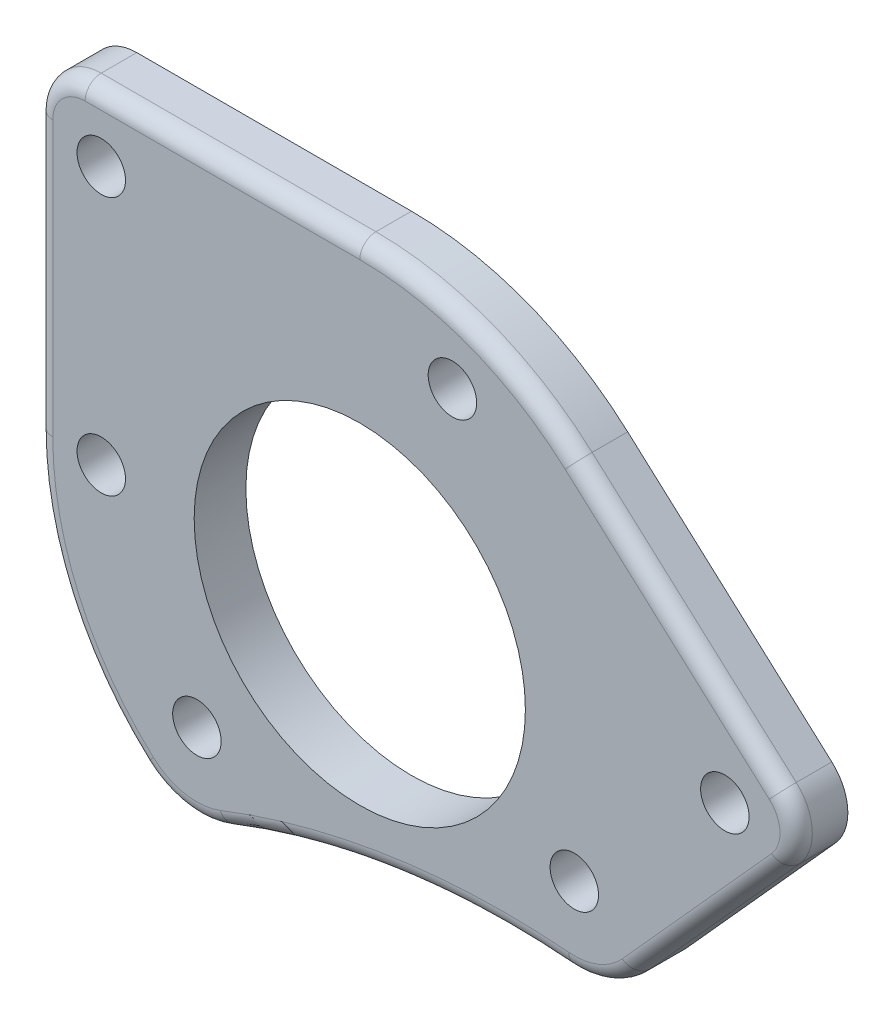
ISO-10303-21;
HEADER;
FILE_DESCRIPTION(('STEP AP214'),'2;1');
FILE_NAME('part.step','',(''),(''),'','','');
FILE_SCHEMA(('AUTOMOTIVE_DESIGN { 1 0 10303 214 1 1 1 1 }'));
ENDSEC;
DATA;
#1=APPLICATION_CONTEXT('core data for automotive mechanical design processes');
#2=APPLICATION_PROTOCOL_DEFINITION('international standard','automotive_design',2000,#1);
#3=PRODUCT_CONTEXT('',#1,'mechanical');
#4=PRODUCT('Part','Part','',(#3));
#5=PRODUCT_RELATED_PRODUCT_CATEGORY('part','',(#4));
#6=PRODUCT_DEFINITION_FORMATION('','',#4);
#7=PRODUCT_DEFINITION_CONTEXT('part definition',#1,'design');
#8=PRODUCT_DEFINITION('design','',#6,#7);
#9=PRODUCT_DEFINITION_SHAPE('','',#8);
#10=(LENGTH_UNIT() NAMED_UNIT(*) SI_UNIT(.MILLI.,.METRE.));
#11=(NAMED_UNIT(*) PLANE_ANGLE_UNIT() SI_UNIT($,.RADIAN.));
#12=(NAMED_UNIT(*) SI_UNIT($,.STERADIAN.) SOLID_ANGLE_UNIT());
#13=UNCERTAINTY_MEASURE_WITH_UNIT(LENGTH_MEASURE(1.E-05),#10,'distance_accuracy_value','');
#14=(GEOMETRIC_REPRESENTATION_CONTEXT(3) GLOBAL_UNCERTAINTY_ASSIGNED_CONTEXT((#13)) GLOBAL_UNIT_ASSIGNED_CONTEXT((#10,
#11,#12)) REPRESENTATION_CONTEXT('',''));
#15=CARTESIAN_POINT('',(0.,0.,0.));
#16=DIRECTION('',(0.,0.,1.));
#17=DIRECTION('',(1.,0.,0.));
#18=AXIS2_PLACEMENT_3D('',#15,#16,#17);
#19=CARTESIAN_POINT('',(-9.04859708366365,60.,3.2));
#20=DIRECTION('',(0.,0.,1.));
#21=DIRECTION('',(1.,0.,0.));
#22=AXIS2_PLACEMENT_3D('',#19,#20,#21);
#23=PLANE('',#22);
#24=DIRECTION('',(-0.743144825477398,0.669130606358854,0.));
#25=VECTOR('',#24,1.);
#26=CARTESIAN_POINT('',(3.66488443715523,74.119751684072,3.2));
#27=LINE('',#26,#25);
#28=CARTESIAN_POINT('',(16.2983464702709,62.7445313759716,3.2));
#29=VERTEX_POINT('',#28);
#30=CARTESIAN_POINT('',(3.66488443715524,74.119751684072,3.2));
#31=VERTEX_POINT('',#30);
#32=EDGE_CURVE('E244',#29,#31,#27,.T.);
#33=ORIENTED_EDGE('',*,*,#32,.T.);
#34=CARTESIAN_POINT('',(-9.04859708366365,60.,3.2));
#35=DIRECTION('',(0.,0.,1.));
#36=DIRECTION('',(1.,0.,0.));
#37=AXIS2_PLACEMENT_3D('',#34,#35,#36);
#38=CIRCLE('',#37,19.0000000000015);
#39=CARTESIAN_POINT('',(-9.0485970836632,79.0000000000015,3.2));
#40=VERTEX_POINT('',#39);
#41=EDGE_CURVE('E246',#31,#40,#38,.T.);
#42=ORIENTED_EDGE('',*,*,#41,.T.);
#43=DIRECTION('',(-1.,0.,0.));
#44=VECTOR('',#43,1.);
#45=CARTESIAN_POINT('',(-26.0485970836631,79.0000000000015,3.2));
#46=LINE('',#45,#44);
#47=CARTESIAN_POINT('',(-26.0485970836632,79.0000000000015,3.2));
#48=VERTEX_POINT('',#47);
#49=EDGE_CURVE('E161',#40,#48,#46,.T.);
#50=ORIENTED_EDGE('',*,*,#49,.T.);
#51=CARTESIAN_POINT('',(-26.0485970836632,77.0000000000015,3.2));
#52=DIRECTION('',(0.,0.,1.));
#53=DIRECTION('',(1.,0.,0.));
#54=AXIS2_PLACEMENT_3D('',#51,#52,#53);
#55=CIRCLE('',#54,2.);
#56=CARTESIAN_POINT('',(-28.0485970836632,77.0000000000015,3.2));
#57=VERTEX_POINT('',#56);
#58=EDGE_CURVE('E228',#48,#57,#55,.T.);
#59=ORIENTED_EDGE('',*,*,#58,.T.);
#60=DIRECTION('',(0.,-1.,0.));
#61=VECTOR('',#60,1.);
#62=CARTESIAN_POINT('',(-28.0485970836632,60.0000000000015,3.2));
#63=LINE('',#62,#61);
#64=CARTESIAN_POINT('',(-28.0485970836632,60.0000000000015,3.2));
#65=VERTEX_POINT('',#64);
#66=EDGE_CURVE('E230',#57,#65,#63,.T.);
#67=ORIENTED_EDGE('',*,*,#66,.T.);
#68=CARTESIAN_POINT('',(-9.04859708366318,60.0000000000015,3.2));
#69=DIRECTION('',(0.,0.,1.));
#70=DIRECTION('',(1.,0.,0.));
#71=AXIS2_PLACEMENT_3D('',#68,#69,#70);
#72=CIRCLE('',#71,19.);
#73=CARTESIAN_POINT('',(-21.8160508217506,45.9290325476266,3.2));
#74=VERTEX_POINT('',#73);
#75=EDGE_CURVE('E232',#65,#74,#72,.T.);
#76=ORIENTED_EDGE('',*,*,#75,.T.);
#77=CARTESIAN_POINT('',(-19.1281658242585,48.8913414849687,3.2));
#78=DIRECTION('',(0.,0.,1.));
#79=DIRECTION('',(1.,0.,0.));
#80=AXIS2_PLACEMENT_3D('',#77,#78,#79);
#81=CIRCLE('',#80,3.99999999999999);
#82=CARTESIAN_POINT('',(-17.6707817614579,45.1662868956379,3.2));
#83=VERTEX_POINT('',#82);
#84=EDGE_CURVE('E234',#74,#83,#81,.T.);
#85=ORIENTED_EDGE('',*,*,#84,.T.);
#86=CARTESIAN_POINT('',(1.11022302462516E-13,1.60982338570648E-12,3.2));
#87=DIRECTION('',(0.,0.,1.));
#88=DIRECTION('',(1.,0.,0.));
#89=AXIS2_PLACEMENT_3D('',#86,#87,#88);
#90=CIRCLE('',#89,48.5);
#91=CARTESIAN_POINT('',(3.90700568195662,48.3423758890822,3.2));
#92=VERTEX_POINT('',#91);
#93=EDGE_CURVE('E236',#83,#92,#90,.F.);
#94=ORIENTED_EDGE('',*,*,#93,.T.);
#95=CARTESIAN_POINT('',(4.22923295469529,52.3293759624084,3.2));
#96=DIRECTION('',(0.,0.,1.));
#97=DIRECTION('',(1.,0.,0.));
#98=AXIS2_PLACEMENT_3D('',#95,#96,#97);
#99=CIRCLE('',#98,4.00000000000005);
#100=CARTESIAN_POINT('',(7.20181225660493,49.652853536973,3.2));
#101=VERTEX_POINT('',#100);
#102=EDGE_CURVE('E238',#92,#101,#99,.T.);
#103=ORIENTED_EDGE('',*,*,#102,.T.);
#104=DIRECTION('',(0.669130606358855,0.743144825477397,0.));
#105=VECTOR('',#104,1.);
#106=CARTESIAN_POINT('',(16.446374908508,59.9199805122991,3.2));
#107=LINE('',#106,#105);
#108=CARTESIAN_POINT('',(16.446374908508,59.9199805122991,3.2));
#109=VERTEX_POINT('',#108);
#110=EDGE_CURVE('E240',#101,#109,#107,.T.);
#111=ORIENTED_EDGE('',*,*,#110,.T.);
#112=CARTESIAN_POINT('',(14.9600852575532,61.2582417250168,3.2));
#113=DIRECTION('',(0.,0.,1.));
#114=DIRECTION('',(1.,0.,0.));
#115=AXIS2_PLACEMENT_3D('',#112,#113,#114);
#116=CIRCLE('',#115,2.00000000000001);
#117=EDGE_CURVE('E242',#109,#29,#116,.T.);
#118=ORIENTED_EDGE('',*,*,#117,.T.);
#119=EDGE_LOOP('',(#33,#42,#50,#59,#67,#76,#85,#94,#103,#111,#118));
#120=FACE_BOUND('',#119,.T.);
#121=CARTESIAN_POINT('',(4.22923295469568,52.3293759624067,3.2));
#122=DIRECTION('',(0.,0.,1.));
#123=DIRECTION('',(1.,0.,0.));
#124=AXIS2_PLACEMENT_3D('',#121,#122,#123);
#125=CIRCLE('',#124,1.50000000000087);
#126=CARTESIAN_POINT('',(5.72923295469655,52.3293759624067,3.2));
#127=VERTEX_POINT('',#126);
#128=EDGE_CURVE('E312',#127,#127,#125,.T.);
#129=ORIENTED_EDGE('',*,*,#128,.F.);
#130=EDGE_LOOP('',(#129));
#131=FACE_BOUND('',#130,.T.);
#132=CARTESIAN_POINT('',(-25.0485970836627,60.0000000000001,3.2));
#133=DIRECTION('',(0.,0.,1.));
#134=DIRECTION('',(1.,0.,0.));
#135=AXIS2_PLACEMENT_3D('',#132,#133,#134);
#136=CIRCLE('',#135,1.50000000000086);
#137=CARTESIAN_POINT('',(-23.5485970836619,60.0000000000001,3.2));
#138=VERTEX_POINT('',#137);
#139=EDGE_CURVE('E324',#138,#138,#136,.T.);
#140=ORIENTED_EDGE('',*,*,#139,.F.);
#141=EDGE_LOOP('',(#140));
#142=FACE_BOUND('',#141,.T.);
#143=CARTESIAN_POINT('',(-25.0485970836626,76.,3.2));
#144=DIRECTION('',(0.,0.,1.));
#145=DIRECTION('',(1.,0.,0.));
#146=AXIS2_PLACEMENT_3D('',#143,#144,#145);
#147=CIRCLE('',#146,1.50000000000096);
#148=CARTESIAN_POINT('',(-23.5485970836616,76.,3.2));
#149=VERTEX_POINT('',#148);
#150=EDGE_CURVE('E336',#149,#149,#147,.T.);
#151=ORIENTED_EDGE('',*,*,#150,.F.);
#152=EDGE_LOOP('',(#151));
#153=FACE_BOUND('',#152,.T.);
#154=CARTESIAN_POINT('',(-9.04859708366351,60.,3.2));
#155=DIRECTION('',(0.,0.,1.));
#156=DIRECTION('',(1.,0.,0.));
#157=AXIS2_PLACEMENT_3D('',#154,#155,#156);
#158=CIRCLE('',#157,10.25);
#159=CARTESIAN_POINT('',(1.20140291633648,60.,3.2));
#160=VERTEX_POINT('',#159);
#161=EDGE_CURVE('E178',#160,#160,#158,.T.);
#162=ORIENTED_EDGE('',*,*,#161,.F.);
#163=EDGE_LOOP('',(#162));
#164=FACE_BOUND('',#163,.T.);
#165=CARTESIAN_POINT('',(-3.31470989093782,74.937286823955,3.2));
#166=DIRECTION('',(0.,0.,1.));
#167=DIRECTION('',(1.,0.,0.));
#168=AXIS2_PLACEMENT_3D('',#165,#166,#167);
#169=CIRCLE('',#168,1.50000000000104);
#170=CARTESIAN_POINT('',(-1.81470989093679,74.937286823955,3.2));
#171=VERTEX_POINT('',#170);
#172=EDGE_CURVE('E330',#171,#171,#169,.T.);
#173=ORIENTED_EDGE('',*,*,#172,.F.);
#174=EDGE_LOOP('',(#173));
#175=FACE_BOUND('',#174,.T.);
#176=CARTESIAN_POINT('',(-19.1281658242582,48.8913414849672,3.2));
#177=DIRECTION('',(0.,0.,1.));
#178=DIRECTION('',(1.,0.,0.));
#179=AXIS2_PLACEMENT_3D('',#176,#177,#178);
#180=CIRCLE('',#179,1.50000000000079);
#181=CARTESIAN_POINT('',(-17.6281658242574,48.8913414849672,3.2));
#182=VERTEX_POINT('',#181);
#183=EDGE_CURVE('E318',#182,#182,#180,.T.);
#184=ORIENTED_EDGE('',*,*,#183,.F.);
#185=EDGE_LOOP('',(#184));
#186=FACE_BOUND('',#185,.T.);
#187=CARTESIAN_POINT('',(13.5478098257173,61.1842275058965,3.2));
#188=DIRECTION('',(0.,0.,1.));
#189=DIRECTION('',(1.,0.,0.));
#190=AXIS2_PLACEMENT_3D('',#187,#188,#189);
#191=CIRCLE('',#190,1.500000000001);
#192=CARTESIAN_POINT('',(15.0478098257183,61.1842275058965,3.2));
#193=VERTEX_POINT('',#192);
#194=EDGE_CURVE('E304',#193,#193,#191,.T.);
#195=ORIENTED_EDGE('',*,*,#194,.F.);
#196=EDGE_LOOP('',(#195));
#197=FACE_BOUND('',#196,.T.);
#198=ADVANCED_FACE('F34',(#120,#131,#142,#153,#164,#175,#186,#197),#23,.T.);
#199=CARTESIAN_POINT('',(-9.04859708366365,60.,0.));
#200=DIRECTION('',(0.,0.,1.));
#201=DIRECTION('',(1.,0.,0.));
#202=AXIS2_PLACEMENT_3D('',#199,#200,#201);
#203=PLANE('',#202);
#204=CARTESIAN_POINT('',(-9.04859708366365,60.,0.));
#205=DIRECTION('',(0.,0.,1.));
#206=DIRECTION('',(1.,0.,0.));
#207=AXIS2_PLACEMENT_3D('',#204,#205,#206);
#208=CIRCLE('',#207,20.0000000000015);
#209=CARTESIAN_POINT('',(4.33401504351408,74.8628965095494,0.));
#210=VERTEX_POINT('',#209);
#211=CARTESIAN_POINT('',(-9.04859708366318,80.0000000000015,0.));
#212=VERTEX_POINT('',#211);
#213=EDGE_CURVE('E169',#210,#212,#208,.T.);
#214=ORIENTED_EDGE('',*,*,#213,.F.);
#215=DIRECTION('',(-0.743144825477398,0.669130606358854,0.));
#216=VECTOR('',#215,1.);
#217=CARTESIAN_POINT('',(4.33401504351408,74.8628965095494,0.));
#218=LINE('',#217,#216);
#219=CARTESIAN_POINT('',(16.9674770766297,63.487676201449,0.));
#220=VERTEX_POINT('',#219);
#221=EDGE_CURVE('E207',#220,#210,#218,.T.);
#222=ORIENTED_EDGE('',*,*,#221,.F.);
#223=CARTESIAN_POINT('',(14.9600852575532,61.2582417250168,0.));
#224=DIRECTION('',(0.,0.,1.));
#225=DIRECTION('',(1.,0.,0.));
#226=AXIS2_PLACEMENT_3D('',#223,#224,#225);
#227=CIRCLE('',#226,3.00000000000001);
#228=CARTESIAN_POINT('',(17.1895197339854,59.2508499059402,0.));
#229=VERTEX_POINT('',#228);
#230=EDGE_CURVE('E204',#229,#220,#227,.T.);
#231=ORIENTED_EDGE('',*,*,#230,.F.);
#232=DIRECTION('',(0.669130606358855,0.743144825477397,0.));
#233=VECTOR('',#232,1.);
#234=CARTESIAN_POINT('',(17.1895197339854,59.2508499059402,0.));
#235=LINE('',#234,#233);
#236=CARTESIAN_POINT('',(7.94495708208234,48.9837229306141,0.));
#237=VERTEX_POINT('',#236);
#238=EDGE_CURVE('E201',#237,#229,#235,.T.);
#239=ORIENTED_EDGE('',*,*,#238,.F.);
#240=CARTESIAN_POINT('',(4.22923295469529,52.3293759624084,0.));
#241=DIRECTION('',(0.,0.,1.));
#242=DIRECTION('',(1.,0.,0.));
#243=AXIS2_PLACEMENT_3D('',#240,#241,#242);
#244=CIRCLE('',#243,5.00000000000005);
#245=CARTESIAN_POINT('',(3.82644886377195,47.3456258707506,0.));
#246=VERTEX_POINT('',#245);
#247=EDGE_CURVE('E198',#246,#237,#244,.T.);
#248=ORIENTED_EDGE('',*,*,#247,.F.);
#249=CARTESIAN_POINT('',(1.11022302462516E-13,1.60982338570648E-12,0.));
#250=DIRECTION('',(0.,0.,-1.));
#251=DIRECTION('',(1.,0.,0.));
#252=AXIS2_PLACEMENT_3D('',#249,#250,#251);
#253=CIRCLE('',#252,47.5);
#254=CARTESIAN_POINT('',(-17.3064357457577,44.2350232483052,0.));
#255=VERTEX_POINT('',#254);
#256=EDGE_CURVE('E195',#255,#246,#253,.T.);
#257=ORIENTED_EDGE('',*,*,#256,.F.);
#258=CARTESIAN_POINT('',(-19.1281658242585,48.8913414849687,0.));
#259=DIRECTION('',(0.,0.,1.));
#260=DIRECTION('',(1.,0.,0.));
#261=AXIS2_PLACEMENT_3D('',#258,#259,#260);
#262=CIRCLE('',#261,4.99999999999999);
#263=CARTESIAN_POINT('',(-22.4880220711237,45.1884553132911,0.));
#264=VERTEX_POINT('',#263);
#265=EDGE_CURVE('E192',#264,#255,#262,.T.);
#266=ORIENTED_EDGE('',*,*,#265,.F.);
#267=CARTESIAN_POINT('',(-9.04859708366318,60.0000000000015,0.));
#268=DIRECTION('',(0.,0.,1.));
#269=DIRECTION('',(1.,0.,0.));
#270=AXIS2_PLACEMENT_3D('',#267,#268,#269);
#271=CIRCLE('',#270,20.);
#272=CARTESIAN_POINT('',(-29.0485970836632,60.0000000000015,0.));
#273=VERTEX_POINT('',#272);
#274=EDGE_CURVE('E189',#273,#264,#271,.T.);
#275=ORIENTED_EDGE('',*,*,#274,.F.);
#276=DIRECTION('',(0.,-1.,0.));
#277=VECTOR('',#276,1.);
#278=CARTESIAN_POINT('',(-29.0485970836632,60.0000000000015,0.));
#279=LINE('',#278,#277);
#280=CARTESIAN_POINT('',(-29.0485970836632,77.0000000000015,0.));
#281=VERTEX_POINT('',#280);
#282=EDGE_CURVE('E186',#281,#273,#279,.T.);
#283=ORIENTED_EDGE('',*,*,#282,.F.);
#284=CARTESIAN_POINT('',(-26.0485970836632,77.0000000000015,0.));
#285=DIRECTION('',(0.,0.,1.));
#286=DIRECTION('',(1.,0.,0.));
#287=AXIS2_PLACEMENT_3D('',#284,#285,#286);
#288=CIRCLE('',#287,3.);
#289=CARTESIAN_POINT('',(-26.0485970836631,80.0000000000015,0.));
#290=VERTEX_POINT('',#289);
#291=EDGE_CURVE('E172',#290,#281,#288,.T.);
#292=ORIENTED_EDGE('',*,*,#291,.F.);
#293=DIRECTION('',(-1.,0.,0.));
#294=VECTOR('',#293,1.);
#295=CARTESIAN_POINT('',(-26.0485970836631,80.0000000000015,0.));
#296=LINE('',#295,#294);
#297=EDGE_CURVE('E154',#212,#290,#296,.T.);
#298=ORIENTED_EDGE('',*,*,#297,.F.);
#299=EDGE_LOOP('',(#214,#222,#231,#239,#248,#257,#266,#275,#283,#292,#298));
#300=FACE_BOUND('',#299,.T.);
#301=CARTESIAN_POINT('',(-9.04859708366351,60.,0.));
#302=DIRECTION('',(0.,0.,1.));
#303=DIRECTION('',(1.,0.,0.));
#304=AXIS2_PLACEMENT_3D('',#301,#302,#303);
#305=CIRCLE('',#304,10.25);
#306=CARTESIAN_POINT('',(1.20140291633648,60.,0.));
#307=VERTEX_POINT('',#306);
#308=EDGE_CURVE('E181',#307,#307,#305,.T.);
#309=ORIENTED_EDGE('',*,*,#308,.T.);
#310=EDGE_LOOP('',(#309));
#311=FACE_BOUND('',#310,.T.);
#312=CARTESIAN_POINT('',(-25.0485970836626,76.,0.));
#313=DIRECTION('',(0.,0.,1.));
#314=DIRECTION('',(1.,0.,0.));
#315=AXIS2_PLACEMENT_3D('',#312,#313,#314);
#316=CIRCLE('',#315,1.50000000000096);
#317=CARTESIAN_POINT('',(-23.5485970836616,76.,0.));
#318=VERTEX_POINT('',#317);
#319=EDGE_CURVE('E333',#318,#318,#316,.T.);
#320=ORIENTED_EDGE('',*,*,#319,.T.);
#321=EDGE_LOOP('',(#320));
#322=FACE_BOUND('',#321,.T.);
#323=CARTESIAN_POINT('',(-3.31470989093782,74.937286823955,0.));
#324=DIRECTION('',(0.,0.,1.));
#325=DIRECTION('',(1.,0.,0.));
#326=AXIS2_PLACEMENT_3D('',#323,#324,#325);
#327=CIRCLE('',#326,1.50000000000104);
#328=CARTESIAN_POINT('',(-1.81470989093679,74.937286823955,0.));
#329=VERTEX_POINT('',#328);
#330=EDGE_CURVE('E327',#329,#329,#327,.T.);
#331=ORIENTED_EDGE('',*,*,#330,.T.);
#332=EDGE_LOOP('',(#331));
#333=FACE_BOUND('',#332,.T.);
#334=CARTESIAN_POINT('',(-25.0485970836627,60.0000000000001,0.));
#335=DIRECTION('',(0.,0.,1.));
#336=DIRECTION('',(1.,0.,0.));
#337=AXIS2_PLACEMENT_3D('',#334,#335,#336);
#338=CIRCLE('',#337,1.50000000000086);
#339=CARTESIAN_POINT('',(-23.5485970836619,60.0000000000001,0.));
#340=VERTEX_POINT('',#339);
#341=EDGE_CURVE('E321',#340,#340,#338,.T.);
#342=ORIENTED_EDGE('',*,*,#341,.T.);
#343=EDGE_LOOP('',(#342));
#344=FACE_BOUND('',#343,.T.);
#345=CARTESIAN_POINT('',(-19.1281658242582,48.8913414849672,0.));
#346=DIRECTION('',(0.,0.,1.));
#347=DIRECTION('',(1.,0.,0.));
#348=AXIS2_PLACEMENT_3D('',#345,#346,#347);
#349=CIRCLE('',#348,1.50000000000079);
#350=CARTESIAN_POINT('',(-17.6281658242574,48.8913414849672,0.));
#351=VERTEX_POINT('',#350);
#352=EDGE_CURVE('E315',#351,#351,#349,.T.);
#353=ORIENTED_EDGE('',*,*,#352,.T.);
#354=EDGE_LOOP('',(#353));
#355=FACE_BOUND('',#354,.T.);
#356=CARTESIAN_POINT('',(4.22923295469568,52.3293759624067,0.));
#357=DIRECTION('',(0.,0.,1.));
#358=DIRECTION('',(1.,0.,0.));
#359=AXIS2_PLACEMENT_3D('',#356,#357,#358);
#360=CIRCLE('',#359,1.50000000000087);
#361=CARTESIAN_POINT('',(5.72923295469655,52.3293759624067,0.));
#362=VERTEX_POINT('',#361);
#363=EDGE_CURVE('E309',#362,#362,#360,.T.);
#364=ORIENTED_EDGE('',*,*,#363,.T.);
#365=EDGE_LOOP('',(#364));
#366=FACE_BOUND('',#365,.T.);
#367=CARTESIAN_POINT('',(13.5478098257173,61.1842275058965,0.));
#368=DIRECTION('',(0.,0.,1.));
#369=DIRECTION('',(1.,0.,0.));
#370=AXIS2_PLACEMENT_3D('',#367,#368,#369);
#371=CIRCLE('',#370,1.500000000001);
#372=CARTESIAN_POINT('',(15.0478098257183,61.1842275058965,0.));
#373=VERTEX_POINT('',#372);
#374=EDGE_CURVE('E298',#373,#373,#371,.T.);
#375=ORIENTED_EDGE('',*,*,#374,.T.);
#376=EDGE_LOOP('',(#375));
#377=FACE_BOUND('',#376,.T.);
#378=ADVANCED_FACE('F166',(#300,#311,#322,#333,#344,#355,#366,#377),#203,.F.);
#379=CARTESIAN_POINT('',(-9.04859708366365,60.,3.2));
#380=DIRECTION('',(0.,0.,-1.));
#381=DIRECTION('',(-1.,0.,0.));
#382=AXIS2_PLACEMENT_3D('',#379,#380,#381);
#383=CYLINDRICAL_SURFACE('',#382,20.0000000000015);
#384=DIRECTION('',(0.,0.,-1.));
#385=VECTOR('',#384,1.);
#386=CARTESIAN_POINT('',(-9.04859708366318,80.0000000000015,3.2));
#387=LINE('',#386,#385);
#388=CARTESIAN_POINT('',(-9.04859708366318,80.0000000000015,2.2));
#389=VERTEX_POINT('',#388);
#390=EDGE_CURVE('E151',#389,#212,#387,.T.);
#391=ORIENTED_EDGE('',*,*,#390,.F.);
#392=CARTESIAN_POINT('',(-9.04859708366365,60.,2.2));
#393=DIRECTION('',(0.,0.,1.));
#394=DIRECTION('',(1.,0.,0.));
#395=AXIS2_PLACEMENT_3D('',#392,#393,#394);
#396=CIRCLE('',#395,20.0000000000015);
#397=CARTESIAN_POINT('',(4.33401504351408,74.8628965095494,2.2));
#398=VERTEX_POINT('',#397);
#399=EDGE_CURVE('E249',#389,#398,#396,.F.);
#400=ORIENTED_EDGE('',*,*,#399,.T.);
#401=DIRECTION('',(0.,0.,-1.));
#402=VECTOR('',#401,1.);
#403=CARTESIAN_POINT('',(4.33401504351408,74.8628965095494,3.2));
#404=LINE('',#403,#402);
#405=EDGE_CURVE('E176',#398,#210,#404,.T.);
#406=ORIENTED_EDGE('',*,*,#405,.T.);
#407=ORIENTED_EDGE('',*,*,#213,.T.);
#408=EDGE_LOOP('',(#391,#400,#406,#407));
#409=FACE_BOUND('',#408,.T.);
#410=ADVANCED_FACE('F174',(#409),#383,.T.);
#411=CARTESIAN_POINT('',(-26.0485970836631,80.0000000000015,3.2));
#412=DIRECTION('',(0.,-1.,0.));
#413=DIRECTION('',(1.,0.,0.));
#414=AXIS2_PLACEMENT_3D('',#411,#412,#413);
#415=PLANE('',#414);
#416=DIRECTION('',(0.,0.,-1.));
#417=VECTOR('',#416,1.);
#418=CARTESIAN_POINT('',(-26.0485970836631,80.0000000000015,3.2));
#419=LINE('',#418,#417);
#420=CARTESIAN_POINT('',(-26.0485970836631,80.0000000000015,2.2));
#421=VERTEX_POINT('',#420);
#422=EDGE_CURVE('E162',#421,#290,#419,.T.);
#423=ORIENTED_EDGE('',*,*,#422,.F.);
#424=DIRECTION('',(-1.,0.,0.));
#425=VECTOR('',#424,1.);
#426=CARTESIAN_POINT('',(-9.04859708366318,80.0000000000015,2.2));
#427=LINE('',#426,#425);
#428=EDGE_CURVE('E11',#421,#389,#427,.F.);
#429=ORIENTED_EDGE('',*,*,#428,.T.);
#430=ORIENTED_EDGE('',*,*,#390,.T.);
#431=ORIENTED_EDGE('',*,*,#297,.T.);
#432=EDGE_LOOP('',(#423,#429,#430,#431));
#433=FACE_BOUND('',#432,.T.);
#434=ADVANCED_FACE('F153',(#433),#415,.F.);
#435=CARTESIAN_POINT('',(-26.0485970836632,77.0000000000015,3.2));
#436=DIRECTION('',(0.,0.,-1.));
#437=DIRECTION('',(-1.,0.,0.));
#438=AXIS2_PLACEMENT_3D('',#435,#436,#437);
#439=CYLINDRICAL_SURFACE('',#438,3.);
#440=DIRECTION('',(0.,0.,-1.));
#441=VECTOR('',#440,1.);
#442=CARTESIAN_POINT('',(-29.0485970836632,77.0000000000015,3.2));
#443=LINE('',#442,#441);
#444=CARTESIAN_POINT('',(-29.0485970836632,77.0000000000015,2.2));
#445=VERTEX_POINT('',#444);
#446=EDGE_CURVE('E224',#445,#281,#443,.T.);
#447=ORIENTED_EDGE('',*,*,#446,.F.);
#448=CARTESIAN_POINT('',(-26.0485970836632,77.0000000000015,2.2));
#449=DIRECTION('',(0.,0.,1.));
#450=DIRECTION('',(1.,0.,0.));
#451=AXIS2_PLACEMENT_3D('',#448,#449,#450);
#452=CIRCLE('',#451,3.);
#453=EDGE_CURVE('E43',#445,#421,#452,.F.);
#454=ORIENTED_EDGE('',*,*,#453,.T.);
#455=ORIENTED_EDGE('',*,*,#422,.T.);
#456=ORIENTED_EDGE('',*,*,#291,.T.);
#457=EDGE_LOOP('',(#447,#454,#455,#456));
#458=FACE_BOUND('',#457,.T.);
#459=ADVANCED_FACE('F399',(#458),#439,.T.);
#460=CARTESIAN_POINT('',(-29.0485970836632,60.0000000000015,3.2));
#461=DIRECTION('',(1.,0.,0.));
#462=DIRECTION('',(0.,0.,-1.));
#463=AXIS2_PLACEMENT_3D('',#460,#461,#462);
#464=PLANE('',#463);
#465=DIRECTION('',(0.,0.,-1.));
#466=VECTOR('',#465,1.);
#467=CARTESIAN_POINT('',(-29.0485970836632,60.0000000000015,3.2));
#468=LINE('',#467,#466);
#469=CARTESIAN_POINT('',(-29.0485970836632,60.0000000000015,2.2));
#470=VERTEX_POINT('',#469);
#471=EDGE_CURVE('E222',#470,#273,#468,.T.);
#472=ORIENTED_EDGE('',*,*,#471,.F.);
#473=DIRECTION('',(0.,-1.,0.));
#474=VECTOR('',#473,1.);
#475=CARTESIAN_POINT('',(-29.0485970836632,77.0000000000015,2.2));
#476=LINE('',#475,#474);
#477=EDGE_CURVE('E58',#470,#445,#476,.F.);
#478=ORIENTED_EDGE('',*,*,#477,.T.);
#479=ORIENTED_EDGE('',*,*,#446,.T.);
#480=ORIENTED_EDGE('',*,*,#282,.T.);
#481=EDGE_LOOP('',(#472,#478,#479,#480));
#482=FACE_BOUND('',#481,.T.);
#483=ADVANCED_FACE('F395',(#482),#464,.F.);
#484=CARTESIAN_POINT('',(-9.04859708366318,60.0000000000015,3.2));
#485=DIRECTION('',(0.,0.,-1.));
#486=DIRECTION('',(-1.,0.,0.));
#487=AXIS2_PLACEMENT_3D('',#484,#485,#486);
#488=CYLINDRICAL_SURFACE('',#487,20.);
#489=DIRECTION('',(0.,0.,-1.));
#490=VECTOR('',#489,1.);
#491=CARTESIAN_POINT('',(-22.4880220711237,45.1884553132911,3.2));
#492=LINE('',#491,#490);
#493=CARTESIAN_POINT('',(-22.4880220711237,45.1884553132911,2.2));
#494=VERTEX_POINT('',#493);
#495=EDGE_CURVE('E220',#494,#264,#492,.T.);
#496=ORIENTED_EDGE('',*,*,#495,.F.);
#497=CARTESIAN_POINT('',(-9.04859708366318,60.0000000000015,2.2));
#498=DIRECTION('',(0.,0.,1.));
#499=DIRECTION('',(1.,0.,0.));
#500=AXIS2_PLACEMENT_3D('',#497,#498,#499);
#501=CIRCLE('',#500,20.);
#502=EDGE_CURVE('E263',#494,#470,#501,.F.);
#503=ORIENTED_EDGE('',*,*,#502,.T.);
#504=ORIENTED_EDGE('',*,*,#471,.T.);
#505=ORIENTED_EDGE('',*,*,#274,.T.);
#506=EDGE_LOOP('',(#496,#503,#504,#505));
#507=FACE_BOUND('',#506,.T.);
#508=ADVANCED_FACE('F391',(#507),#488,.T.);
#509=CARTESIAN_POINT('',(-19.1281658242585,48.8913414849687,3.2));
#510=DIRECTION('',(0.,0.,-1.));
#511=DIRECTION('',(-1.,0.,0.));
#512=AXIS2_PLACEMENT_3D('',#509,#510,#511);
#513=CYLINDRICAL_SURFACE('',#512,4.99999999999999);
#514=DIRECTION('',(0.,0.,-1.));
#515=VECTOR('',#514,1.);
#516=CARTESIAN_POINT('',(-17.3064357457577,44.2350232483052,3.2));
#517=LINE('',#516,#515);
#518=CARTESIAN_POINT('',(-17.3064357457577,44.2350232483052,2.2));
#519=VERTEX_POINT('',#518);
#520=EDGE_CURVE('E218',#519,#255,#517,.T.);
#521=ORIENTED_EDGE('',*,*,#520,.F.);
#522=CARTESIAN_POINT('',(-19.1281658242585,48.8913414849687,2.2));
#523=DIRECTION('',(0.,0.,1.));
#524=DIRECTION('',(1.,0.,0.));
#525=AXIS2_PLACEMENT_3D('',#522,#523,#524);
#526=CIRCLE('',#525,4.99999999999999);
#527=EDGE_CURVE('E261',#519,#494,#526,.F.);
#528=ORIENTED_EDGE('',*,*,#527,.T.);
#529=ORIENTED_EDGE('',*,*,#495,.T.);
#530=ORIENTED_EDGE('',*,*,#265,.T.);
#531=EDGE_LOOP('',(#521,#528,#529,#530));
#532=FACE_BOUND('',#531,.T.);
#533=ADVANCED_FACE('F387',(#532),#513,.T.);
#534=CARTESIAN_POINT('',(1.11022302462516E-13,1.60982338570648E-12,3.2));
#535=DIRECTION('',(0.,0.,-1.));
#536=DIRECTION('',(-1.,0.,0.));
#537=AXIS2_PLACEMENT_3D('',#534,#535,#536);
#538=CYLINDRICAL_SURFACE('',#537,47.5);
#539=DIRECTION('',(0.,0.,-1.));
#540=VECTOR('',#539,1.);
#541=CARTESIAN_POINT('',(3.82644886377195,47.3456258707506,3.2));
#542=LINE('',#541,#540);
#543=CARTESIAN_POINT('',(3.82644886377195,47.3456258707506,2.2));
#544=VERTEX_POINT('',#543);
#545=EDGE_CURVE('E216',#544,#246,#542,.T.);
#546=ORIENTED_EDGE('',*,*,#545,.F.);
#547=CARTESIAN_POINT('',(1.11022302462516E-13,1.60982338570648E-12,2.2));
#548=DIRECTION('',(0.,0.,1.));
#549=DIRECTION('',(1.,0.,0.));
#550=AXIS2_PLACEMENT_3D('',#547,#548,#549);
#551=CIRCLE('',#550,47.5);
#552=EDGE_CURVE('E259',#544,#519,#551,.T.);
#553=ORIENTED_EDGE('',*,*,#552,.T.);
#554=ORIENTED_EDGE('',*,*,#520,.T.);
#555=ORIENTED_EDGE('',*,*,#256,.T.);
#556=EDGE_LOOP('',(#546,#553,#554,#555));
#557=FACE_BOUND('',#556,.T.);
#558=ADVANCED_FACE('F383',(#557),#538,.F.);
#559=CARTESIAN_POINT('',(4.22923295469529,52.3293759624084,3.2));
#560=DIRECTION('',(0.,0.,-1.));
#561=DIRECTION('',(-1.,0.,0.));
#562=AXIS2_PLACEMENT_3D('',#559,#560,#561);
#563=CYLINDRICAL_SURFACE('',#562,5.00000000000005);
#564=DIRECTION('',(0.,0.,-1.));
#565=VECTOR('',#564,1.);
#566=CARTESIAN_POINT('',(7.94495708208234,48.9837229306141,3.2));
#567=LINE('',#566,#565);
#568=CARTESIAN_POINT('',(7.94495708208234,48.9837229306141,2.2));
#569=VERTEX_POINT('',#568);
#570=EDGE_CURVE('E214',#569,#237,#567,.T.);
#571=ORIENTED_EDGE('',*,*,#570,.F.);
#572=CARTESIAN_POINT('',(4.22923295469529,52.3293759624084,2.2));
#573=DIRECTION('',(0.,0.,1.));
#574=DIRECTION('',(1.,0.,0.));
#575=AXIS2_PLACEMENT_3D('',#572,#573,#574);
#576=CIRCLE('',#575,5.00000000000005);
#577=EDGE_CURVE('E257',#569,#544,#576,.F.);
#578=ORIENTED_EDGE('',*,*,#577,.T.);
#579=ORIENTED_EDGE('',*,*,#545,.T.);
#580=ORIENTED_EDGE('',*,*,#247,.T.);
#581=EDGE_LOOP('',(#571,#578,#579,#580));
#582=FACE_BOUND('',#581,.T.);
#583=ADVANCED_FACE('F379',(#582),#563,.T.);
#584=CARTESIAN_POINT('',(17.1895197339854,59.2508499059402,3.2));
#585=DIRECTION('',(-0.743144825477397,0.669130606358855,0.));
#586=DIRECTION('',(-0.669130606358855,-0.743144825477397,0.));
#587=AXIS2_PLACEMENT_3D('',#584,#585,#586);
#588=PLANE('',#587);
#589=DIRECTION('',(0.,0.,-1.));
#590=VECTOR('',#589,1.);
#591=CARTESIAN_POINT('',(17.1895197339854,59.2508499059402,3.2));
#592=LINE('',#591,#590);
#593=CARTESIAN_POINT('',(17.1895197339854,59.2508499059402,2.2));
#594=VERTEX_POINT('',#593);
#595=EDGE_CURVE('E212',#594,#229,#592,.T.);
#596=ORIENTED_EDGE('',*,*,#595,.F.);
#597=DIRECTION('',(0.669130606358855,0.743144825477397,0.));
#598=VECTOR('',#597,1.);
#599=CARTESIAN_POINT('',(7.94495708208234,48.9837229306141,2.2));
#600=LINE('',#599,#598);
#601=EDGE_CURVE('E255',#594,#569,#600,.F.);
#602=ORIENTED_EDGE('',*,*,#601,.T.);
#603=ORIENTED_EDGE('',*,*,#570,.T.);
#604=ORIENTED_EDGE('',*,*,#238,.T.);
#605=EDGE_LOOP('',(#596,#602,#603,#604));
#606=FACE_BOUND('',#605,.T.);
#607=ADVANCED_FACE('F375',(#606),#588,.F.);
#608=CARTESIAN_POINT('',(14.9600852575532,61.2582417250168,3.2));
#609=DIRECTION('',(0.,0.,-1.));
#610=DIRECTION('',(-1.,0.,0.));
#611=AXIS2_PLACEMENT_3D('',#608,#609,#610);
#612=CYLINDRICAL_SURFACE('',#611,3.00000000000001);
#613=DIRECTION('',(0.,0.,-1.));
#614=VECTOR('',#613,1.);
#615=CARTESIAN_POINT('',(16.9674770766297,63.487676201449,3.2));
#616=LINE('',#615,#614);
#617=CARTESIAN_POINT('',(16.9674770766297,63.487676201449,2.2));
#618=VERTEX_POINT('',#617);
#619=EDGE_CURVE('E210',#618,#220,#616,.T.);
#620=ORIENTED_EDGE('',*,*,#619,.F.);
#621=CARTESIAN_POINT('',(14.9600852575532,61.2582417250168,2.2));
#622=DIRECTION('',(0.,0.,1.));
#623=DIRECTION('',(1.,0.,0.));
#624=AXIS2_PLACEMENT_3D('',#621,#622,#623);
#625=CIRCLE('',#624,3.00000000000001);
#626=EDGE_CURVE('E253',#618,#594,#625,.F.);
#627=ORIENTED_EDGE('',*,*,#626,.T.);
#628=ORIENTED_EDGE('',*,*,#595,.T.);
#629=ORIENTED_EDGE('',*,*,#230,.T.);
#630=EDGE_LOOP('',(#620,#627,#628,#629));
#631=FACE_BOUND('',#630,.T.);
#632=ADVANCED_FACE('F371',(#631),#612,.T.);
#633=CARTESIAN_POINT('',(4.33401504351408,74.8628965095494,3.2));
#634=DIRECTION('',(-0.669130606358854,-0.743144825477398,0.));
#635=DIRECTION('',(0.743144825477398,-0.669130606358854,0.));
#636=AXIS2_PLACEMENT_3D('',#633,#634,#635);
#637=PLANE('',#636);
#638=ORIENTED_EDGE('',*,*,#405,.F.);
#639=DIRECTION('',(-0.743144825477398,0.669130606358854,0.));
#640=VECTOR('',#639,1.);
#641=CARTESIAN_POINT('',(16.9674770766297,63.487676201449,2.2));
#642=LINE('',#641,#640);
#643=EDGE_CURVE('E251',#398,#618,#642,.F.);
#644=ORIENTED_EDGE('',*,*,#643,.T.);
#645=ORIENTED_EDGE('',*,*,#619,.T.);
#646=ORIENTED_EDGE('',*,*,#221,.T.);
#647=EDGE_LOOP('',(#638,#644,#645,#646));
#648=FACE_BOUND('',#647,.T.);
#649=ADVANCED_FACE('F357',(#648),#637,.F.);
#650=CARTESIAN_POINT('',(-9.04859708366351,60.,3.2));
#651=DIRECTION('',(0.,0.,-1.));
#652=DIRECTION('',(-1.,0.,0.));
#653=AXIS2_PLACEMENT_3D('',#650,#651,#652);
#654=CYLINDRICAL_SURFACE('',#653,10.25);
#655=ORIENTED_EDGE('',*,*,#161,.T.);
#656=EDGE_LOOP('',(#655));
#657=FACE_BOUND('',#656,.T.);
#658=ORIENTED_EDGE('',*,*,#308,.F.);
#659=EDGE_LOOP('',(#658));
#660=FACE_BOUND('',#659,.T.);
#661=ADVANCED_FACE('F347',(#657,#660),#654,.F.);
#662=CARTESIAN_POINT('',(-25.0485970836626,76.,3.2));
#663=DIRECTION('',(0.,0.,-1.));
#664=DIRECTION('',(-1.,0.,0.));
#665=AXIS2_PLACEMENT_3D('',#662,#663,#664);
#666=CYLINDRICAL_SURFACE('',#665,1.50000000000096);
#667=ORIENTED_EDGE('',*,*,#150,.T.);
#668=EDGE_LOOP('',(#667));
#669=FACE_BOUND('',#668,.T.);
#670=ORIENTED_EDGE('',*,*,#319,.F.);
#671=EDGE_LOOP('',(#670));
#672=FACE_BOUND('',#671,.T.);
#673=ADVANCED_FACE('F344',(#669,#672),#666,.F.);
#674=CARTESIAN_POINT('',(-3.31470989093782,74.937286823955,3.2));
#675=DIRECTION('',(0.,0.,-1.));
#676=DIRECTION('',(-1.,0.,0.));
#677=AXIS2_PLACEMENT_3D('',#674,#675,#676);
#678=CYLINDRICAL_SURFACE('',#677,1.50000000000104);
#679=ORIENTED_EDGE('',*,*,#172,.T.);
#680=EDGE_LOOP('',(#679));
#681=FACE_BOUND('',#680,.T.);
#682=ORIENTED_EDGE('',*,*,#330,.F.);
#683=EDGE_LOOP('',(#682));
#684=FACE_BOUND('',#683,.T.);
#685=ADVANCED_FACE('F346',(#681,#684),#678,.F.);
#686=CARTESIAN_POINT('',(-25.0485970836627,60.0000000000001,3.2));
#687=DIRECTION('',(0.,0.,-1.));
#688=DIRECTION('',(-1.,0.,0.));
#689=AXIS2_PLACEMENT_3D('',#686,#687,#688);
#690=CYLINDRICAL_SURFACE('',#689,1.50000000000086);
#691=ORIENTED_EDGE('',*,*,#139,.T.);
#692=EDGE_LOOP('',(#691));
#693=FACE_BOUND('',#692,.T.);
#694=ORIENTED_EDGE('',*,*,#341,.F.);
#695=EDGE_LOOP('',(#694));
#696=FACE_BOUND('',#695,.T.);
#697=ADVANCED_FACE('F354',(#693,#696),#690,.F.);
#698=CARTESIAN_POINT('',(-19.1281658242582,48.8913414849672,3.2));
#699=DIRECTION('',(0.,0.,-1.));
#700=DIRECTION('',(-1.,0.,0.));
#701=AXIS2_PLACEMENT_3D('',#698,#699,#700);
#702=CYLINDRICAL_SURFACE('',#701,1.50000000000079);
#703=ORIENTED_EDGE('',*,*,#183,.T.);
#704=EDGE_LOOP('',(#703));
#705=FACE_BOUND('',#704,.T.);
#706=ORIENTED_EDGE('',*,*,#352,.F.);
#707=EDGE_LOOP('',(#706));
#708=FACE_BOUND('',#707,.T.);
#709=ADVANCED_FACE('F491',(#705,#708),#702,.F.);
#710=CARTESIAN_POINT('',(4.22923295469568,52.3293759624067,3.2));
#711=DIRECTION('',(0.,0.,-1.));
#712=DIRECTION('',(-1.,0.,0.));
#713=AXIS2_PLACEMENT_3D('',#710,#711,#712);
#714=CYLINDRICAL_SURFACE('',#713,1.50000000000087);
#715=ORIENTED_EDGE('',*,*,#128,.T.);
#716=EDGE_LOOP('',(#715));
#717=FACE_BOUND('',#716,.T.);
#718=ORIENTED_EDGE('',*,*,#363,.F.);
#719=EDGE_LOOP('',(#718));
#720=FACE_BOUND('',#719,.T.);
#721=ADVANCED_FACE('F450',(#717,#720),#714,.F.);
#722=CARTESIAN_POINT('',(13.5478098257173,61.1842275058965,3.2));
#723=DIRECTION('',(0.,0.,-1.));
#724=DIRECTION('',(-1.,0.,0.));
#725=AXIS2_PLACEMENT_3D('',#722,#723,#724);
#726=CYLINDRICAL_SURFACE('',#725,1.500000000001);
#727=ORIENTED_EDGE('',*,*,#194,.T.);
#728=EDGE_LOOP('',(#727));
#729=FACE_BOUND('',#728,.T.);
#730=ORIENTED_EDGE('',*,*,#374,.F.);
#731=EDGE_LOOP('',(#730));
#732=FACE_BOUND('',#731,.T.);
#733=ADVANCED_FACE('F445',(#729,#732),#726,.F.);
#734=CARTESIAN_POINT('',(1.11022302462516E-13,1.60982338570648E-12,2.2));
#735=DIRECTION('',(0.,0.,1.));
#736=DIRECTION('',(1.,0.,0.));
#737=AXIS2_PLACEMENT_3D('',#734,#735,#736);
#738=TOROIDAL_SURFACE('',#737,48.5,1.);
#739=CARTESIAN_POINT('',(3.90700568195662,48.3423758890822,2.2));
#740=DIRECTION('',(0.996750018331558,-0.0805568181846685,0.));
#741=DIRECTION('',(0.0805568181846685,0.996750018331559,0.));
#742=AXIS2_PLACEMENT_3D('',#739,#740,#741);
#743=CIRCLE('',#742,1.);
#744=EDGE_CURVE('E291',#92,#544,#743,.T.);
#745=ORIENTED_EDGE('',*,*,#744,.F.);
#746=ORIENTED_EDGE('',*,*,#93,.F.);
#747=CARTESIAN_POINT('',(-17.6707817614579,45.1662868956379,2.2));
#748=DIRECTION('',(-0.931263647332706,-0.364346015700166,0.));
#749=DIRECTION('',(0.364346015700166,-0.931263647332706,0.));
#750=AXIS2_PLACEMENT_3D('',#747,#748,#749);
#751=CIRCLE('',#750,1.);
#752=EDGE_CURVE('E38',#519,#83,#751,.T.);
#753=ORIENTED_EDGE('',*,*,#752,.F.);
#754=ORIENTED_EDGE('',*,*,#552,.F.);
#755=EDGE_LOOP('',(#745,#746,#753,#754));
#756=FACE_BOUND('',#755,.T.);
#757=ADVANCED_FACE('F36',(#756),#738,.T.);
#758=CARTESIAN_POINT('',(-19.1281658242585,48.8913414849687,2.2));
#759=DIRECTION('',(0.,0.,1.));
#760=DIRECTION('',(1.,0.,0.));
#761=AXIS2_PLACEMENT_3D('',#758,#759,#760);
#762=TOROIDAL_SURFACE('',#761,3.99999999999999,1.);
#763=ORIENTED_EDGE('',*,*,#752,.T.);
#764=ORIENTED_EDGE('',*,*,#84,.F.);
#765=CARTESIAN_POINT('',(-21.8160508217506,45.9290325476266,2.2));
#766=DIRECTION('',(-0.740577234335524,0.671971249373027,0.));
#767=DIRECTION('',(-0.671971249373027,-0.740577234335524,0.));
#768=AXIS2_PLACEMENT_3D('',#765,#766,#767);
#769=CIRCLE('',#768,1.);
#770=EDGE_CURVE('E289',#494,#74,#769,.T.);
#771=ORIENTED_EDGE('',*,*,#770,.F.);
#772=ORIENTED_EDGE('',*,*,#527,.F.);
#773=EDGE_LOOP('',(#763,#764,#771,#772));
#774=FACE_BOUND('',#773,.T.);
#775=ADVANCED_FACE('F440',(#774),#762,.T.);
#776=CARTESIAN_POINT('',(4.22923295469529,52.3293759624084,2.2));
#777=DIRECTION('',(0.,0.,1.));
#778=DIRECTION('',(1.,0.,0.));
#779=AXIS2_PLACEMENT_3D('',#776,#777,#778);
#780=TOROIDAL_SURFACE('',#779,4.00000000000005,1.);
#781=ORIENTED_EDGE('',*,*,#744,.T.);
#782=ORIENTED_EDGE('',*,*,#577,.F.);
#783=CARTESIAN_POINT('',(7.20181225660493,49.652853536973,2.2));
#784=DIRECTION('',(0.66913060635886,0.743144825477393,0.));
#785=DIRECTION('',(-0.743144825477393,0.66913060635886,0.));
#786=AXIS2_PLACEMENT_3D('',#783,#784,#785);
#787=CIRCLE('',#786,1.);
#788=EDGE_CURVE('E286',#101,#569,#787,.T.);
#789=ORIENTED_EDGE('',*,*,#788,.F.);
#790=ORIENTED_EDGE('',*,*,#102,.F.);
#791=EDGE_LOOP('',(#781,#782,#789,#790));
#792=FACE_BOUND('',#791,.T.);
#793=ADVANCED_FACE('F437',(#792),#780,.T.);
#794=CARTESIAN_POINT('',(-9.04859708366318,60.0000000000015,2.2));
#795=DIRECTION('',(0.,0.,1.));
#796=DIRECTION('',(1.,0.,0.));
#797=AXIS2_PLACEMENT_3D('',#794,#795,#796);
#798=TOROIDAL_SURFACE('',#797,19.,1.);
#799=ORIENTED_EDGE('',*,*,#770,.T.);
#800=ORIENTED_EDGE('',*,*,#75,.F.);
#801=CARTESIAN_POINT('',(-28.0485970836632,60.0000000000015,2.2));
#802=DIRECTION('',(0.,1.,0.));
#803=DIRECTION('',(0.,0.,1.));
#804=AXIS2_PLACEMENT_3D('',#801,#802,#803);
#805=CIRCLE('',#804,1.);
#806=EDGE_CURVE('E283',#470,#65,#805,.T.);
#807=ORIENTED_EDGE('',*,*,#806,.F.);
#808=ORIENTED_EDGE('',*,*,#502,.F.);
#809=EDGE_LOOP('',(#799,#800,#807,#808));
#810=FACE_BOUND('',#809,.T.);
#811=ADVANCED_FACE('F433',(#810),#798,.T.);
#812=CARTESIAN_POINT('',(5.07115460040641,47.2865184791822,2.2));
#813=DIRECTION('',(-0.669130606358855,-0.743144825477397,0.));
#814=DIRECTION('',(0.743144825477397,-0.669130606358855,0.));
#815=AXIS2_PLACEMENT_3D('',#812,#813,#814);
#816=CYLINDRICAL_SURFACE('',#815,1.);
#817=ORIENTED_EDGE('',*,*,#788,.T.);
#818=ORIENTED_EDGE('',*,*,#601,.F.);
#819=CARTESIAN_POINT('',(16.446374908508,59.9199805122991,2.2));
#820=DIRECTION('',(0.669130606358853,0.743144825477399,0.));
#821=DIRECTION('',(-0.743144825477399,0.669130606358853,0.));
#822=AXIS2_PLACEMENT_3D('',#819,#820,#821);
#823=CIRCLE('',#822,1.);
#824=EDGE_CURVE('E280',#109,#594,#823,.T.);
#825=ORIENTED_EDGE('',*,*,#824,.F.);
#826=ORIENTED_EDGE('',*,*,#110,.F.);
#827=EDGE_LOOP('',(#817,#818,#825,#826));
#828=FACE_BOUND('',#827,.T.);
#829=ADVANCED_FACE('F429',(#828),#816,.T.);
#830=CARTESIAN_POINT('',(-28.0485970836632,60.,2.2));
#831=DIRECTION('',(0.,1.,0.));
#832=DIRECTION('',(0.,0.,1.));
#833=AXIS2_PLACEMENT_3D('',#830,#831,#832);
#834=CYLINDRICAL_SURFACE('',#833,1.);
#835=ORIENTED_EDGE('',*,*,#806,.T.);
#836=ORIENTED_EDGE('',*,*,#66,.F.);
#837=CARTESIAN_POINT('',(-28.0485970836632,77.0000000000015,2.2));
#838=DIRECTION('',(0.,1.,0.));
#839=DIRECTION('',(0.,0.,1.));
#840=AXIS2_PLACEMENT_3D('',#837,#838,#839);
#841=CIRCLE('',#840,1.);
#842=EDGE_CURVE('E277',#445,#57,#841,.T.);
#843=ORIENTED_EDGE('',*,*,#842,.F.);
#844=ORIENTED_EDGE('',*,*,#477,.F.);
#845=EDGE_LOOP('',(#835,#836,#843,#844));
#846=FACE_BOUND('',#845,.T.);
#847=ADVANCED_FACE('F425',(#846),#834,.T.);
#848=CARTESIAN_POINT('',(14.9600852575532,61.2582417250168,2.2));
#849=DIRECTION('',(0.,0.,1.));
#850=DIRECTION('',(1.,0.,0.));
#851=AXIS2_PLACEMENT_3D('',#848,#849,#850);
#852=TOROIDAL_SURFACE('',#851,2.00000000000001,1.);
#853=ORIENTED_EDGE('',*,*,#824,.T.);
#854=ORIENTED_EDGE('',*,*,#626,.F.);
#855=CARTESIAN_POINT('',(16.2983464702709,62.7445313759716,2.2));
#856=DIRECTION('',(-0.743144825477398,0.669130606358854,0.));
#857=DIRECTION('',(-0.669130606358854,-0.743144825477398,0.));
#858=AXIS2_PLACEMENT_3D('',#855,#856,#857);
#859=CIRCLE('',#858,1.);
#860=EDGE_CURVE('E274',#29,#618,#859,.T.);
#861=ORIENTED_EDGE('',*,*,#860,.F.);
#862=ORIENTED_EDGE('',*,*,#117,.F.);
#863=EDGE_LOOP('',(#853,#854,#861,#862));
#864=FACE_BOUND('',#863,.T.);
#865=ADVANCED_FACE('F421',(#864),#852,.T.);
#866=CARTESIAN_POINT('',(-26.0485970836632,77.0000000000015,2.2));
#867=DIRECTION('',(0.,0.,1.));
#868=DIRECTION('',(1.,0.,0.));
#869=AXIS2_PLACEMENT_3D('',#866,#867,#868);
#870=TOROIDAL_SURFACE('',#869,2.,1.);
#871=ORIENTED_EDGE('',*,*,#842,.T.);
#872=ORIENTED_EDGE('',*,*,#58,.F.);
#873=CARTESIAN_POINT('',(-26.0485970836632,79.0000000000015,2.2));
#874=DIRECTION('',(1.,0.,0.));
#875=DIRECTION('',(0.,1.,0.));
#876=AXIS2_PLACEMENT_3D('',#873,#874,#875);
#877=CIRCLE('',#876,1.);
#878=EDGE_CURVE('E271',#421,#48,#877,.T.);
#879=ORIENTED_EDGE('',*,*,#878,.F.);
#880=ORIENTED_EDGE('',*,*,#453,.F.);
#881=EDGE_LOOP('',(#871,#872,#879,#880));
#882=FACE_BOUND('',#881,.T.);
#883=ADVANCED_FACE('F417',(#882),#870,.T.);
#884=CARTESIAN_POINT('',(3.66488443715557,74.1197516840717,2.2));
#885=DIRECTION('',(0.743144825477398,-0.669130606358854,0.));
#886=DIRECTION('',(0.669130606358854,0.743144825477398,0.));
#887=AXIS2_PLACEMENT_3D('',#884,#885,#886);
#888=CYLINDRICAL_SURFACE('',#887,1.);
#889=ORIENTED_EDGE('',*,*,#860,.T.);
#890=ORIENTED_EDGE('',*,*,#643,.F.);
#891=CARTESIAN_POINT('',(3.66488443715524,74.119751684072,2.2));
#892=DIRECTION('',(-0.743144825477412,0.669130606358839,0.));
#893=DIRECTION('',(-0.669130606358839,-0.743144825477412,0.));
#894=AXIS2_PLACEMENT_3D('',#891,#892,#893);
#895=CIRCLE('',#894,1.);
#896=EDGE_CURVE('E269',#31,#398,#895,.T.);
#897=ORIENTED_EDGE('',*,*,#896,.F.);
#898=ORIENTED_EDGE('',*,*,#32,.F.);
#899=EDGE_LOOP('',(#889,#890,#897,#898));
#900=FACE_BOUND('',#899,.T.);
#901=ADVANCED_FACE('F413',(#900),#888,.T.);
#902=CARTESIAN_POINT('',(-9.04859708366362,79.0000000000015,2.2));
#903=DIRECTION('',(1.,0.,0.));
#904=DIRECTION('',(0.,1.,0.));
#905=AXIS2_PLACEMENT_3D('',#902,#903,#904);
#906=CYLINDRICAL_SURFACE('',#905,1.);
#907=ORIENTED_EDGE('',*,*,#878,.T.);
#908=ORIENTED_EDGE('',*,*,#49,.F.);
#909=CARTESIAN_POINT('',(-9.04859708366318,79.0000000000015,2.2));
#910=DIRECTION('',(1.,0.,0.));
#911=DIRECTION('',(0.,0.,-1.));
#912=AXIS2_PLACEMENT_3D('',#909,#910,#911);
#913=CIRCLE('',#912,1.);
#914=EDGE_CURVE('E267',#389,#40,#913,.T.);
#915=ORIENTED_EDGE('',*,*,#914,.F.);
#916=ORIENTED_EDGE('',*,*,#428,.F.);
#917=EDGE_LOOP('',(#907,#908,#915,#916));
#918=FACE_BOUND('',#917,.T.);
#919=ADVANCED_FACE('F409',(#918),#906,.T.);
#920=CARTESIAN_POINT('',(-9.04859708366365,60.,2.2));
#921=DIRECTION('',(0.,0.,1.));
#922=DIRECTION('',(1.,0.,0.));
#923=AXIS2_PLACEMENT_3D('',#920,#921,#922);
#924=TOROIDAL_SURFACE('',#923,19.0000000000015,1.);
#925=ORIENTED_EDGE('',*,*,#896,.T.);
#926=ORIENTED_EDGE('',*,*,#399,.F.);
#927=ORIENTED_EDGE('',*,*,#914,.T.);
#928=ORIENTED_EDGE('',*,*,#41,.F.);
#929=EDGE_LOOP('',(#925,#926,#927,#928));
#930=FACE_BOUND('',#929,.T.);
#931=ADVANCED_FACE('F406',(#930),#924,.T.);
#932=CLOSED_SHELL('',(#198,#378,#410,#434,#459,#483,#508,#533,#558,#583,#607,#632,#649,#661,
#673,#685,#697,#709,#721,#733,#757,#775,#793,#811,#829,#847,#865,#883,#901,#919,#931));
#933=MANIFOLD_SOLID_BREP('B2',#932);
#934=ADVANCED_BREP_SHAPE_REPRESENTATION('',(#18,#933),#14);
#935=SHAPE_DEFINITION_REPRESENTATION(#9,#934);
ENDSEC;
END-ISO-10303-21;
